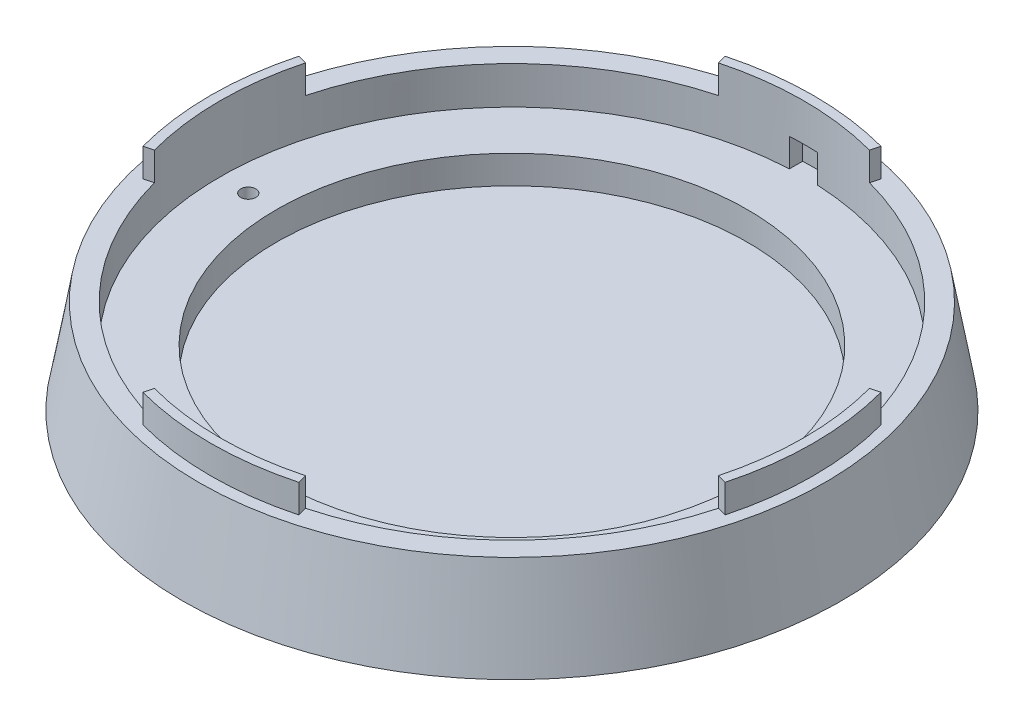
ISO-10303-21;
HEADER;
FILE_DESCRIPTION(('STEP AP214'),'2;1');
FILE_NAME('part.step','',(''),(''),'','','');
FILE_SCHEMA(('AUTOMOTIVE_DESIGN { 1 0 10303 214 1 1 1 1 }'));
ENDSEC;
DATA;
#1=APPLICATION_CONTEXT('core data for automotive mechanical design processes');
#2=APPLICATION_PROTOCOL_DEFINITION('international standard','automotive_design',2000,#1);
#3=PRODUCT_CONTEXT('',#1,'mechanical');
#4=PRODUCT('Part','Part','',(#3));
#5=PRODUCT_RELATED_PRODUCT_CATEGORY('part','',(#4));
#6=PRODUCT_DEFINITION_FORMATION('','',#4);
#7=PRODUCT_DEFINITION_CONTEXT('part definition',#1,'design');
#8=PRODUCT_DEFINITION('design','',#6,#7);
#9=PRODUCT_DEFINITION_SHAPE('','',#8);
#10=(LENGTH_UNIT() NAMED_UNIT(*) SI_UNIT(.MILLI.,.METRE.));
#11=(NAMED_UNIT(*) PLANE_ANGLE_UNIT() SI_UNIT($,.RADIAN.));
#12=(NAMED_UNIT(*) SI_UNIT($,.STERADIAN.) SOLID_ANGLE_UNIT());
#13=UNCERTAINTY_MEASURE_WITH_UNIT(LENGTH_MEASURE(1.E-05),#10,'distance_accuracy_value','');
#14=(GEOMETRIC_REPRESENTATION_CONTEXT(3) GLOBAL_UNCERTAINTY_ASSIGNED_CONTEXT((#13)) GLOBAL_UNIT_ASSIGNED_CONTEXT((#10,
#11,#12)) REPRESENTATION_CONTEXT('',''));
#15=CARTESIAN_POINT('',(0.,0.,0.));
#16=DIRECTION('',(0.,0.,1.));
#17=DIRECTION('',(1.,0.,0.));
#18=AXIS2_PLACEMENT_3D('',#15,#16,#17);
#19=CARTESIAN_POINT('',(0.,10.,0.));
#20=DIRECTION('',(0.,-1.,0.));
#21=DIRECTION('',(0.,0.,-1.));
#22=AXIS2_PLACEMENT_3D('',#19,#20,#21);
#23=CYLINDRICAL_SURFACE('',#22,31.);
#24=CARTESIAN_POINT('',(0.,10.,0.));
#25=DIRECTION('',(0.,1.,0.));
#26=DIRECTION('',(0.,0.,1.));
#27=AXIS2_PLACEMENT_3D('',#24,#25,#26);
#28=CIRCLE('',#27,31.);
#29=CARTESIAN_POINT('',(8.02339039817786,10.,29.9437006149612));
#30=VERTEX_POINT('',#29);
#31=CARTESIAN_POINT('',(29.9437006149611,10.,8.02339039817817));
#32=VERTEX_POINT('',#31);
#33=EDGE_CURVE('E328',#30,#32,#28,.T.);
#34=ORIENTED_EDGE('',*,*,#33,.T.);
#35=DIRECTION('',(0.,-1.,0.));
#36=VECTOR('',#35,1.);
#37=CARTESIAN_POINT('',(29.9437006149611,13.,8.02339039817817));
#38=LINE('',#37,#36);
#39=CARTESIAN_POINT('',(29.9437006149611,13.,8.02339039817817));
#40=VERTEX_POINT('',#39);
#41=EDGE_CURVE('E276',#40,#32,#38,.T.);
#42=ORIENTED_EDGE('',*,*,#41,.F.);
#43=CARTESIAN_POINT('',(0.,13.,0.));
#44=DIRECTION('',(0.,-1.,0.));
#45=DIRECTION('',(0.,0.,-1.));
#46=AXIS2_PLACEMENT_3D('',#43,#44,#45);
#47=CIRCLE('',#46,31.);
#48=CARTESIAN_POINT('',(29.9437006149612,13.,-8.02339039817797));
#49=VERTEX_POINT('',#48);
#50=EDGE_CURVE('E297',#49,#40,#47,.T.);
#51=ORIENTED_EDGE('',*,*,#50,.F.);
#52=DIRECTION('',(0.,-1.,0.));
#53=VECTOR('',#52,1.);
#54=CARTESIAN_POINT('',(29.9437006149612,13.,-8.02339039817797));
#55=LINE('',#54,#53);
#56=CARTESIAN_POINT('',(29.9437006149612,10.,-8.02339039817797));
#57=VERTEX_POINT('',#56);
#58=EDGE_CURVE('E280',#49,#57,#55,.T.);
#59=ORIENTED_EDGE('',*,*,#58,.T.);
#60=CARTESIAN_POINT('',(8.02339039817807,10.,-29.9437006149611));
#61=VERTEX_POINT('',#60);
#62=EDGE_CURVE('E334',#57,#61,#28,.T.);
#63=ORIENTED_EDGE('',*,*,#62,.T.);
#64=DIRECTION('',(0.,-1.,0.));
#65=VECTOR('',#64,1.);
#66=CARTESIAN_POINT('',(8.02339039817807,13.,-29.9437006149611));
#67=LINE('',#66,#65);
#68=CARTESIAN_POINT('',(8.02339039817807,13.,-29.9437006149611));
#69=VERTEX_POINT('',#68);
#70=EDGE_CURVE('E197',#69,#61,#67,.T.);
#71=ORIENTED_EDGE('',*,*,#70,.F.);
#72=CARTESIAN_POINT('',(0.,13.,0.));
#73=DIRECTION('',(0.,-1.,0.));
#74=DIRECTION('',(0.,0.,-1.));
#75=AXIS2_PLACEMENT_3D('',#72,#73,#74);
#76=CIRCLE('',#75,31.);
#77=CARTESIAN_POINT('',(-8.02339039817806,13.,-29.9437006149611));
#78=VERTEX_POINT('',#77);
#79=EDGE_CURVE('E186',#78,#69,#76,.T.);
#80=ORIENTED_EDGE('',*,*,#79,.F.);
#81=DIRECTION('',(0.,-1.,0.));
#82=VECTOR('',#81,1.);
#83=CARTESIAN_POINT('',(-8.02339039817806,13.,-29.9437006149611));
#84=LINE('',#83,#82);
#85=CARTESIAN_POINT('',(-8.02339039817806,10.,-29.9437006149611));
#86=VERTEX_POINT('',#85);
#87=EDGE_CURVE('E193',#78,#86,#84,.T.);
#88=ORIENTED_EDGE('',*,*,#87,.T.);
#89=CARTESIAN_POINT('',(-29.9437006149611,10.,-8.02339039817838));
#90=VERTEX_POINT('',#89);
#91=EDGE_CURVE('E636',#86,#90,#28,.T.);
#92=ORIENTED_EDGE('',*,*,#91,.T.);
#93=DIRECTION('',(0.,-1.,0.));
#94=VECTOR('',#93,1.);
#95=CARTESIAN_POINT('',(-29.9437006149611,13.,-8.02339039817837));
#96=LINE('',#95,#94);
#97=CARTESIAN_POINT('',(-29.9437006149611,13.,-8.02339039817837));
#98=VERTEX_POINT('',#97);
#99=EDGE_CURVE('E66',#98,#90,#96,.T.);
#100=ORIENTED_EDGE('',*,*,#99,.F.);
#101=CARTESIAN_POINT('',(0.,13.,0.));
#102=DIRECTION('',(0.,-1.,0.));
#103=DIRECTION('',(0.,0.,-1.));
#104=AXIS2_PLACEMENT_3D('',#101,#102,#103);
#105=CIRCLE('',#104,31.);
#106=CARTESIAN_POINT('',(-29.9437006149612,13.,8.02339039817777));
#107=VERTEX_POINT('',#106);
#108=EDGE_CURVE('E247',#107,#98,#105,.T.);
#109=ORIENTED_EDGE('',*,*,#108,.F.);
#110=DIRECTION('',(0.,-1.,0.));
#111=VECTOR('',#110,1.);
#112=CARTESIAN_POINT('',(-29.9437006149612,13.,8.02339039817777));
#113=LINE('',#112,#111);
#114=CARTESIAN_POINT('',(-29.9437006149612,10.,8.02339039817777));
#115=VERTEX_POINT('',#114);
#116=EDGE_CURVE('E228',#107,#115,#113,.T.);
#117=ORIENTED_EDGE('',*,*,#116,.T.);
#118=CARTESIAN_POINT('',(-8.02339039817827,10.,29.9437006149611));
#119=VERTEX_POINT('',#118);
#120=EDGE_CURVE('E335',#115,#119,#28,.T.);
#121=ORIENTED_EDGE('',*,*,#120,.T.);
#122=DIRECTION('',(0.,-1.,0.));
#123=VECTOR('',#122,1.);
#124=CARTESIAN_POINT('',(-8.02339039817826,13.,29.9437006149611));
#125=LINE('',#124,#123);
#126=CARTESIAN_POINT('',(-8.02339039817826,13.,29.9437006149611));
#127=VERTEX_POINT('',#126);
#128=EDGE_CURVE('E59',#127,#119,#125,.T.);
#129=ORIENTED_EDGE('',*,*,#128,.F.);
#130=CARTESIAN_POINT('',(0.,13.,0.));
#131=DIRECTION('',(0.,-1.,0.));
#132=DIRECTION('',(0.,0.,-1.));
#133=AXIS2_PLACEMENT_3D('',#130,#131,#132);
#134=CIRCLE('',#133,31.);
#135=CARTESIAN_POINT('',(8.02339039817786,13.,29.9437006149612));
#136=VERTEX_POINT('',#135);
#137=EDGE_CURVE('E271',#136,#127,#134,.T.);
#138=ORIENTED_EDGE('',*,*,#137,.F.);
#139=DIRECTION('',(0.,-1.,0.));
#140=VECTOR('',#139,1.);
#141=CARTESIAN_POINT('',(8.02339039817786,13.,29.9437006149612));
#142=LINE('',#141,#140);
#143=EDGE_CURVE('E255',#136,#30,#142,.T.);
#144=ORIENTED_EDGE('',*,*,#143,.T.);
#145=EDGE_LOOP('',(#34,#42,#51,#59,#63,#71,#80,#88,#92,#100,#109,#117,#121,#129,#138,#144));
#146=FACE_BOUND('',#145,.T.);
#147=CARTESIAN_POINT('',(0.,6.,0.));
#148=DIRECTION('',(0.,1.,0.));
#149=DIRECTION('',(0.,0.,1.));
#150=AXIS2_PLACEMENT_3D('',#147,#148,#149);
#151=CIRCLE('',#150,31.);
#152=CARTESIAN_POINT('',(-1.5,6.,-30.9636884107821));
#153=VERTEX_POINT('',#152);
#154=CARTESIAN_POINT('',(1.5,6.,-30.9636884107821));
#155=VERTEX_POINT('',#154);
#156=EDGE_CURVE('E327',#153,#155,#151,.T.);
#157=ORIENTED_EDGE('',*,*,#156,.F.);
#158=DIRECTION('',(0.,-1.,0.));
#159=VECTOR('',#158,1.);
#160=CARTESIAN_POINT('',(-1.5,10.,-30.9636884107821));
#161=LINE('',#160,#159);
#162=CARTESIAN_POINT('',(-1.5,9.,-30.9636884107821));
#163=VERTEX_POINT('',#162);
#164=EDGE_CURVE('E323',#153,#163,#161,.F.);
#165=ORIENTED_EDGE('',*,*,#164,.T.);
#166=CARTESIAN_POINT('',(0.,9.,0.));
#167=DIRECTION('',(0.,-1.,0.));
#168=DIRECTION('',(0.,0.,-1.));
#169=AXIS2_PLACEMENT_3D('',#166,#167,#168);
#170=CIRCLE('',#169,31.);
#171=CARTESIAN_POINT('',(1.5,9.,-30.9636884107821));
#172=VERTEX_POINT('',#171);
#173=EDGE_CURVE('E11',#163,#172,#170,.T.);
#174=ORIENTED_EDGE('',*,*,#173,.T.);
#175=DIRECTION('',(0.,-1.,0.));
#176=VECTOR('',#175,1.);
#177=CARTESIAN_POINT('',(1.5,10.,-30.9636884107821));
#178=LINE('',#177,#176);
#179=EDGE_CURVE('E325',#172,#155,#178,.T.);
#180=ORIENTED_EDGE('',*,*,#179,.T.);
#181=EDGE_LOOP('',(#157,#165,#174,#180));
#182=FACE_BOUND('',#181,.T.);
#183=ADVANCED_FACE('F43',(#146,#182),#23,.F.);
#184=CARTESIAN_POINT('',(0.,0.,0.));
#185=DIRECTION('',(0.,-1.,0.));
#186=DIRECTION('',(0.,0.,1.));
#187=AXIS2_PLACEMENT_3D('',#184,#185,#186);
#188=CONICAL_SURFACE('',#187,35.,0.174532925199433);
#189=CARTESIAN_POINT('',(0.,0.,0.));
#190=DIRECTION('',(0.,1.,0.));
#191=DIRECTION('',(0.,0.,1.));
#192=AXIS2_PLACEMENT_3D('',#189,#190,#191);
#193=CIRCLE('',#192,35.);
#194=CARTESIAN_POINT('',(0.,0.,35.));
#195=VERTEX_POINT('',#194);
#196=EDGE_CURVE('E51',#195,#195,#193,.T.);
#197=ORIENTED_EDGE('',*,*,#196,.T.);
#198=EDGE_LOOP('',(#197));
#199=FACE_BOUND('',#198,.T.);
#200=CARTESIAN_POINT('',(0.,10.,0.));
#201=DIRECTION('',(0.,1.,0.));
#202=DIRECTION('',(0.,0.,1.));
#203=AXIS2_PLACEMENT_3D('',#200,#201,#202);
#204=CIRCLE('',#203,33.2367301929154);
#205=CARTESIAN_POINT('',(0.,10.,33.2367301929154));
#206=VERTEX_POINT('',#205);
#207=EDGE_CURVE('E337',#206,#206,#204,.T.);
#208=ORIENTED_EDGE('',*,*,#207,.F.);
#209=EDGE_LOOP('',(#208));
#210=FACE_BOUND('',#209,.T.);
#211=ADVANCED_FACE('F44',(#199,#210),#188,.T.);
#212=CARTESIAN_POINT('',(0.,0.,0.));
#213=DIRECTION('',(0.,1.,0.));
#214=DIRECTION('',(0.,0.,1.));
#215=AXIS2_PLACEMENT_3D('',#212,#213,#214);
#216=PLANE('',#215);
#217=ORIENTED_EDGE('',*,*,#196,.F.);
#218=EDGE_LOOP('',(#217));
#219=FACE_BOUND('',#218,.T.);
#220=ADVANCED_FACE('F359',(#219),#216,.F.);
#221=CARTESIAN_POINT('',(0.,10.,0.));
#222=DIRECTION('',(0.,1.,0.));
#223=DIRECTION('',(0.,0.,1.));
#224=AXIS2_PLACEMENT_3D('',#221,#222,#223);
#225=PLANE('',#224);
#226=DIRECTION('',(0.258819045102505,0.,0.965925826289072));
#227=VECTOR('',#226,1.);
#228=CARTESIAN_POINT('',(-8.28220944328057,10.,-30.9096264412502));
#229=LINE('',#228,#227);
#230=CARTESIAN_POINT('',(-8.28220944328058,10.,-30.9096264412502));
#231=VERTEX_POINT('',#230);
#232=EDGE_CURVE('E213',#231,#86,#229,.T.);
#233=ORIENTED_EDGE('',*,*,#232,.F.);
#234=CARTESIAN_POINT('',(0.,10.,0.));
#235=DIRECTION('',(0.,-1.,0.));
#236=DIRECTION('',(0.,0.,-1.));
#237=AXIS2_PLACEMENT_3D('',#234,#235,#236);
#238=CIRCLE('',#237,32.);
#239=CARTESIAN_POINT('',(8.28220944328058,10.,-30.9096264412502));
#240=VERTEX_POINT('',#239);
#241=EDGE_CURVE('E212',#231,#240,#238,.T.);
#242=ORIENTED_EDGE('',*,*,#241,.T.);
#243=DIRECTION('',(-0.258819045102506,0.,0.965925826289072));
#244=VECTOR('',#243,1.);
#245=CARTESIAN_POINT('',(8.28220944328058,10.,-30.9096264412502));
#246=LINE('',#245,#244);
#247=EDGE_CURVE('E633',#240,#61,#246,.T.);
#248=ORIENTED_EDGE('',*,*,#247,.T.);
#249=ORIENTED_EDGE('',*,*,#62,.F.);
#250=DIRECTION('',(-0.965925826289073,0.,0.258819045102502));
#251=VECTOR('',#250,1.);
#252=CARTESIAN_POINT('',(30.9096264412502,10.,-8.28220944328046));
#253=LINE('',#252,#251);
#254=CARTESIAN_POINT('',(30.9096264412502,10.,-8.28220944328046));
#255=VERTEX_POINT('',#254);
#256=EDGE_CURVE('E251',#255,#57,#253,.T.);
#257=ORIENTED_EDGE('',*,*,#256,.F.);
#258=CARTESIAN_POINT('',(0.,10.,0.));
#259=DIRECTION('',(0.,-1.,0.));
#260=DIRECTION('',(0.,0.,-1.));
#261=AXIS2_PLACEMENT_3D('',#258,#259,#260);
#262=CIRCLE('',#261,32.);
#263=CARTESIAN_POINT('',(30.9096264412502,10.,8.28220944328068));
#264=VERTEX_POINT('',#263);
#265=EDGE_CURVE('E287',#255,#264,#262,.T.);
#266=ORIENTED_EDGE('',*,*,#265,.T.);
#267=DIRECTION('',(-0.965925826289072,0.,-0.258819045102509));
#268=VECTOR('',#267,1.);
#269=CARTESIAN_POINT('',(30.9096264412502,10.,8.28220944328068));
#270=LINE('',#269,#268);
#271=EDGE_CURVE('E286',#264,#32,#270,.T.);
#272=ORIENTED_EDGE('',*,*,#271,.T.);
#273=ORIENTED_EDGE('',*,*,#33,.F.);
#274=DIRECTION('',(-0.258819045102499,0.,-0.965925826289074));
#275=VECTOR('',#274,1.);
#276=CARTESIAN_POINT('',(8.28220944328036,10.,30.9096264412503));
#277=LINE('',#276,#275);
#278=CARTESIAN_POINT('',(8.28220944328036,10.,30.9096264412503));
#279=VERTEX_POINT('',#278);
#280=EDGE_CURVE('E226',#279,#30,#277,.T.);
#281=ORIENTED_EDGE('',*,*,#280,.F.);
#282=CARTESIAN_POINT('',(0.,10.,0.));
#283=DIRECTION('',(0.,-1.,0.));
#284=DIRECTION('',(0.,0.,-1.));
#285=AXIS2_PLACEMENT_3D('',#282,#283,#284);
#286=CIRCLE('',#285,32.);
#287=CARTESIAN_POINT('',(-8.28220944328079,10.,30.9096264412502));
#288=VERTEX_POINT('',#287);
#289=EDGE_CURVE('E261',#279,#288,#286,.T.);
#290=ORIENTED_EDGE('',*,*,#289,.T.);
#291=DIRECTION('',(0.258819045102511,0.,-0.965925826289071));
#292=VECTOR('',#291,1.);
#293=CARTESIAN_POINT('',(-8.28220944328079,10.,30.9096264412502));
#294=LINE('',#293,#292);
#295=EDGE_CURVE('E263',#288,#119,#294,.T.);
#296=ORIENTED_EDGE('',*,*,#295,.T.);
#297=ORIENTED_EDGE('',*,*,#120,.F.);
#298=DIRECTION('',(0.965925826289076,0.,-0.258819045102494));
#299=VECTOR('',#298,1.);
#300=CARTESIAN_POINT('',(-30.9096264412503,10.,8.28220944328025));
#301=LINE('',#300,#299);
#302=CARTESIAN_POINT('',(-30.9096264412503,10.,8.28220944328025));
#303=VERTEX_POINT('',#302);
#304=EDGE_CURVE('E241',#303,#115,#301,.T.);
#305=ORIENTED_EDGE('',*,*,#304,.F.);
#306=CARTESIAN_POINT('',(0.,10.,0.));
#307=DIRECTION('',(0.,-1.,0.));
#308=DIRECTION('',(0.,0.,-1.));
#309=AXIS2_PLACEMENT_3D('',#306,#307,#308);
#310=CIRCLE('',#309,32.);
#311=CARTESIAN_POINT('',(-30.9096264412501,10.,-8.2822094432809));
#312=VERTEX_POINT('',#311);
#313=EDGE_CURVE('E232',#303,#312,#310,.T.);
#314=ORIENTED_EDGE('',*,*,#313,.T.);
#315=DIRECTION('',(0.96592582628907,0.,0.258819045102516));
#316=VECTOR('',#315,1.);
#317=CARTESIAN_POINT('',(-30.9096264412501,10.,-8.2822094432809));
#318=LINE('',#317,#316);
#319=EDGE_CURVE('E238',#312,#90,#318,.T.);
#320=ORIENTED_EDGE('',*,*,#319,.T.);
#321=ORIENTED_EDGE('',*,*,#91,.F.);
#322=EDGE_LOOP('',(#233,#242,#248,#249,#257,#266,#272,#273,#281,#290,#296,#297,#305,#314,#320,#321));
#323=FACE_BOUND('',#322,.T.);
#324=ORIENTED_EDGE('',*,*,#207,.T.);
#325=EDGE_LOOP('',(#324));
#326=FACE_BOUND('',#325,.T.);
#327=ADVANCED_FACE('F365',(#323,#326),#225,.T.);
#328=CARTESIAN_POINT('',(0.,6.,0.));
#329=DIRECTION('',(0.,1.,0.));
#330=DIRECTION('',(0.,0.,1.));
#331=AXIS2_PLACEMENT_3D('',#328,#329,#330);
#332=PLANE('',#331);
#333=ORIENTED_EDGE('',*,*,#156,.T.);
#334=DIRECTION('',(0.,0.,-1.));
#335=VECTOR('',#334,1.);
#336=CARTESIAN_POINT('',(1.5,6.,-30.5426221518449));
#337=LINE('',#336,#335);
#338=CARTESIAN_POINT('',(1.5,6.,-32.3652591523689));
#339=VERTEX_POINT('',#338);
#340=EDGE_CURVE('E308',#155,#339,#337,.T.);
#341=ORIENTED_EDGE('',*,*,#340,.T.);
#342=CARTESIAN_POINT('',(0.,6.,0.));
#343=DIRECTION('',(0.,1.,0.));
#344=DIRECTION('',(0.,0.,-1.));
#345=AXIS2_PLACEMENT_3D('',#342,#343,#344);
#346=CIRCLE('',#345,32.4);
#347=CARTESIAN_POINT('',(-1.5,6.,-32.3652591523689));
#348=VERTEX_POINT('',#347);
#349=EDGE_CURVE('E220',#339,#348,#346,.T.);
#350=ORIENTED_EDGE('',*,*,#349,.T.);
#351=DIRECTION('',(0.,0.,1.));
#352=VECTOR('',#351,1.);
#353=CARTESIAN_POINT('',(-1.5,6.,-32.3652591523689));
#354=LINE('',#353,#352);
#355=EDGE_CURVE('E219',#348,#153,#354,.T.);
#356=ORIENTED_EDGE('',*,*,#355,.T.);
#357=EDGE_LOOP('',(#333,#341,#350,#356));
#358=FACE_BOUND('',#357,.T.);
#359=CARTESIAN_POINT('',(-28.,6.,0.));
#360=DIRECTION('',(0.,1.,0.));
#361=DIRECTION('',(0.,0.,1.));
#362=AXIS2_PLACEMENT_3D('',#359,#360,#361);
#363=CIRCLE('',#362,0.799999999999999);
#364=CARTESIAN_POINT('',(-28.,6.,0.799999999999999));
#365=VERTEX_POINT('',#364);
#366=EDGE_CURVE('E338',#365,#365,#363,.T.);
#367=ORIENTED_EDGE('',*,*,#366,.F.);
#368=EDGE_LOOP('',(#367));
#369=FACE_BOUND('',#368,.T.);
#370=CARTESIAN_POINT('',(28.,6.,0.));
#371=DIRECTION('',(0.,1.,0.));
#372=DIRECTION('',(0.,0.,1.));
#373=AXIS2_PLACEMENT_3D('',#370,#371,#372);
#374=CIRCLE('',#373,0.799999999999999);
#375=CARTESIAN_POINT('',(28.,6.,0.799999999999999));
#376=VERTEX_POINT('',#375);
#377=EDGE_CURVE('E344',#376,#376,#374,.T.);
#378=ORIENTED_EDGE('',*,*,#377,.F.);
#379=EDGE_LOOP('',(#378));
#380=FACE_BOUND('',#379,.T.);
#381=CARTESIAN_POINT('',(0.,6.,0.));
#382=DIRECTION('',(0.,1.,0.));
#383=DIRECTION('',(0.,0.,1.));
#384=AXIS2_PLACEMENT_3D('',#381,#382,#383);
#385=CIRCLE('',#384,25.);
#386=CARTESIAN_POINT('',(0.,6.,25.));
#387=VERTEX_POINT('',#386);
#388=EDGE_CURVE('E332',#387,#387,#385,.T.);
#389=ORIENTED_EDGE('',*,*,#388,.F.);
#390=EDGE_LOOP('',(#389));
#391=FACE_BOUND('',#390,.T.);
#392=ADVANCED_FACE('F370',(#358,#369,#380,#391),#332,.T.);
#393=CARTESIAN_POINT('',(0.,3.,0.));
#394=DIRECTION('',(0.,1.,0.));
#395=DIRECTION('',(0.,0.,1.));
#396=AXIS2_PLACEMENT_3D('',#393,#394,#395);
#397=PLANE('',#396);
#398=CARTESIAN_POINT('',(0.,3.,0.));
#399=DIRECTION('',(0.,1.,0.));
#400=DIRECTION('',(0.,0.,1.));
#401=AXIS2_PLACEMENT_3D('',#398,#399,#400);
#402=CIRCLE('',#401,25.);
#403=CARTESIAN_POINT('',(0.,3.,25.));
#404=VERTEX_POINT('',#403);
#405=EDGE_CURVE('E352',#404,#404,#402,.T.);
#406=ORIENTED_EDGE('',*,*,#405,.T.);
#407=EDGE_LOOP('',(#406));
#408=FACE_BOUND('',#407,.T.);
#409=ADVANCED_FACE('F400',(#408),#397,.T.);
#410=CARTESIAN_POINT('',(0.,3.,0.));
#411=DIRECTION('',(0.,1.,0.));
#412=DIRECTION('',(0.,0.,1.));
#413=AXIS2_PLACEMENT_3D('',#410,#411,#412);
#414=CYLINDRICAL_SURFACE('',#413,25.);
#415=ORIENTED_EDGE('',*,*,#405,.F.);
#416=EDGE_LOOP('',(#415));
#417=FACE_BOUND('',#416,.T.);
#418=ORIENTED_EDGE('',*,*,#388,.T.);
#419=EDGE_LOOP('',(#418));
#420=FACE_BOUND('',#419,.T.);
#421=ADVANCED_FACE('F397',(#417,#420),#414,.F.);
#422=CARTESIAN_POINT('',(28.,2.48068849522205,0.));
#423=DIRECTION('',(0.,1.,0.));
#424=DIRECTION('',(0.,0.,1.));
#425=AXIS2_PLACEMENT_3D('',#422,#423,#424);
#426=CONICAL_SURFACE('',#425,0.799999999999999,1.02974425867665);
#427=CARTESIAN_POINT('',(28.,2.,0.));
#428=VERTEX_POINT('',#427);
#429=VERTEX_LOOP('',#428);
#430=FACE_BOUND('',#429,.T.);
#431=CARTESIAN_POINT('',(28.,2.48068849522205,0.));
#432=DIRECTION('',(0.,1.,0.));
#433=DIRECTION('',(0.,0.,1.));
#434=AXIS2_PLACEMENT_3D('',#431,#432,#433);
#435=CIRCLE('',#434,0.799999999999999);
#436=CARTESIAN_POINT('',(28.,2.48068849522205,0.799999999999999));
#437=VERTEX_POINT('',#436);
#438=EDGE_CURVE('E346',#437,#437,#435,.T.);
#439=ORIENTED_EDGE('',*,*,#438,.T.);
#440=EDGE_LOOP('',(#439));
#441=FACE_BOUND('',#440,.T.);
#442=ADVANCED_FACE('F395',(#430,#441),#426,.F.);
#443=CARTESIAN_POINT('',(28.,6.,0.));
#444=DIRECTION('',(0.,1.,0.));
#445=DIRECTION('',(0.,0.,1.));
#446=AXIS2_PLACEMENT_3D('',#443,#444,#445);
#447=CYLINDRICAL_SURFACE('',#446,0.799999999999999);
#448=ORIENTED_EDGE('',*,*,#438,.F.);
#449=EDGE_LOOP('',(#448));
#450=FACE_BOUND('',#449,.T.);
#451=ORIENTED_EDGE('',*,*,#377,.T.);
#452=EDGE_LOOP('',(#451));
#453=FACE_BOUND('',#452,.T.);
#454=ADVANCED_FACE('F389',(#450,#453),#447,.F.);
#455=CARTESIAN_POINT('',(-28.,2.48068849522205,0.));
#456=DIRECTION('',(0.,1.,0.));
#457=DIRECTION('',(0.,0.,1.));
#458=AXIS2_PLACEMENT_3D('',#455,#456,#457);
#459=CONICAL_SURFACE('',#458,0.799999999999999,1.02974425867665);
#460=CARTESIAN_POINT('',(-28.,2.,0.));
#461=VERTEX_POINT('',#460);
#462=VERTEX_LOOP('',#461);
#463=FACE_BOUND('',#462,.T.);
#464=CARTESIAN_POINT('',(-28.,2.48068849522205,0.));
#465=DIRECTION('',(0.,1.,0.));
#466=DIRECTION('',(0.,0.,1.));
#467=AXIS2_PLACEMENT_3D('',#464,#465,#466);
#468=CIRCLE('',#467,0.799999999999999);
#469=CARTESIAN_POINT('',(-28.,2.48068849522205,0.799999999999999));
#470=VERTEX_POINT('',#469);
#471=EDGE_CURVE('E339',#470,#470,#468,.T.);
#472=ORIENTED_EDGE('',*,*,#471,.T.);
#473=EDGE_LOOP('',(#472));
#474=FACE_BOUND('',#473,.T.);
#475=ADVANCED_FACE('F381',(#463,#474),#459,.F.);
#476=CARTESIAN_POINT('',(-28.,6.,0.));
#477=DIRECTION('',(0.,1.,0.));
#478=DIRECTION('',(0.,0.,1.));
#479=AXIS2_PLACEMENT_3D('',#476,#477,#478);
#480=CYLINDRICAL_SURFACE('',#479,0.799999999999999);
#481=ORIENTED_EDGE('',*,*,#471,.F.);
#482=EDGE_LOOP('',(#481));
#483=FACE_BOUND('',#482,.T.);
#484=ORIENTED_EDGE('',*,*,#366,.T.);
#485=EDGE_LOOP('',(#484));
#486=FACE_BOUND('',#485,.T.);
#487=ADVANCED_FACE('F379',(#483,#486),#480,.F.);
#488=CARTESIAN_POINT('',(0.,9.,0.));
#489=DIRECTION('',(0.,-1.,0.));
#490=DIRECTION('',(0.,0.,-1.));
#491=AXIS2_PLACEMENT_3D('',#488,#489,#490);
#492=CYLINDRICAL_SURFACE('',#491,32.4);
#493=ORIENTED_EDGE('',*,*,#349,.F.);
#494=DIRECTION('',(0.,-1.,0.));
#495=VECTOR('',#494,1.);
#496=CARTESIAN_POINT('',(1.5,9.,-32.3652591523689));
#497=LINE('',#496,#495);
#498=CARTESIAN_POINT('',(1.5,9.,-32.3652591523689));
#499=VERTEX_POINT('',#498);
#500=EDGE_CURVE('E315',#499,#339,#497,.T.);
#501=ORIENTED_EDGE('',*,*,#500,.F.);
#502=CARTESIAN_POINT('',(0.,9.,0.));
#503=DIRECTION('',(0.,1.,0.));
#504=DIRECTION('',(0.,0.,-1.));
#505=AXIS2_PLACEMENT_3D('',#502,#503,#504);
#506=CIRCLE('',#505,32.4);
#507=CARTESIAN_POINT('',(-1.5,9.,-32.3652591523689));
#508=VERTEX_POINT('',#507);
#509=EDGE_CURVE('E302',#499,#508,#506,.T.);
#510=ORIENTED_EDGE('',*,*,#509,.T.);
#511=DIRECTION('',(0.,-1.,0.));
#512=VECTOR('',#511,1.);
#513=CARTESIAN_POINT('',(-1.5,9.,-32.3652591523689));
#514=LINE('',#513,#512);
#515=EDGE_CURVE('E316',#508,#348,#514,.T.);
#516=ORIENTED_EDGE('',*,*,#515,.T.);
#517=EDGE_LOOP('',(#493,#501,#510,#516));
#518=FACE_BOUND('',#517,.T.);
#519=ADVANCED_FACE('F384',(#518),#492,.F.);
#520=CARTESIAN_POINT('',(-1.5,9.,-32.3652591523689));
#521=DIRECTION('',(1.,0.,0.));
#522=DIRECTION('',(0.,0.,-1.));
#523=AXIS2_PLACEMENT_3D('',#520,#521,#522);
#524=PLANE('',#523);
#525=ORIENTED_EDGE('',*,*,#355,.F.);
#526=ORIENTED_EDGE('',*,*,#515,.F.);
#527=DIRECTION('',(0.,0.,1.));
#528=VECTOR('',#527,1.);
#529=CARTESIAN_POINT('',(-1.5,9.,-32.3652591523689));
#530=LINE('',#529,#528);
#531=EDGE_CURVE('E310',#508,#163,#530,.T.);
#532=ORIENTED_EDGE('',*,*,#531,.T.);
#533=ORIENTED_EDGE('',*,*,#164,.F.);
#534=EDGE_LOOP('',(#525,#526,#532,#533));
#535=FACE_BOUND('',#534,.T.);
#536=ADVANCED_FACE('F429',(#535),#524,.T.);
#537=CARTESIAN_POINT('',(1.5,9.,-30.5426221518449));
#538=DIRECTION('',(-1.,0.,0.));
#539=DIRECTION('',(0.,0.,1.));
#540=AXIS2_PLACEMENT_3D('',#537,#538,#539);
#541=PLANE('',#540);
#542=DIRECTION('',(0.,0.,-1.));
#543=VECTOR('',#542,1.);
#544=CARTESIAN_POINT('',(1.5,9.,-30.5426221518449));
#545=LINE('',#544,#543);
#546=EDGE_CURVE('E311',#172,#499,#545,.T.);
#547=ORIENTED_EDGE('',*,*,#546,.T.);
#548=ORIENTED_EDGE('',*,*,#500,.T.);
#549=ORIENTED_EDGE('',*,*,#340,.F.);
#550=ORIENTED_EDGE('',*,*,#179,.F.);
#551=EDGE_LOOP('',(#547,#548,#549,#550));
#552=FACE_BOUND('',#551,.T.);
#553=ADVANCED_FACE('F422',(#552),#541,.T.);
#554=CARTESIAN_POINT('',(0.,9.,0.));
#555=DIRECTION('',(0.,-1.,0.));
#556=DIRECTION('',(0.,0.,-1.));
#557=AXIS2_PLACEMENT_3D('',#554,#555,#556);
#558=PLANE('',#557);
#559=ORIENTED_EDGE('',*,*,#531,.F.);
#560=ORIENTED_EDGE('',*,*,#509,.F.);
#561=ORIENTED_EDGE('',*,*,#546,.F.);
#562=ORIENTED_EDGE('',*,*,#173,.F.);
#563=EDGE_LOOP('',(#559,#560,#561,#562));
#564=FACE_BOUND('',#563,.T.);
#565=ADVANCED_FACE('F431',(#564),#558,.T.);
#566=CARTESIAN_POINT('',(30.9096264412502,13.,-8.28220944328046));
#567=DIRECTION('',(0.258819045102502,0.,0.965925826289073));
#568=DIRECTION('',(0.965925826289074,0.,-0.258819045102502));
#569=AXIS2_PLACEMENT_3D('',#566,#567,#568);
#570=PLANE('',#569);
#571=ORIENTED_EDGE('',*,*,#256,.T.);
#572=ORIENTED_EDGE('',*,*,#58,.F.);
#573=DIRECTION('',(-0.965925826289073,0.,0.258819045102502));
#574=VECTOR('',#573,1.);
#575=CARTESIAN_POINT('',(30.9096264412502,13.,-8.28220944328046));
#576=LINE('',#575,#574);
#577=CARTESIAN_POINT('',(30.9096264412502,13.,-8.28220944328046));
#578=VERTEX_POINT('',#577);
#579=EDGE_CURVE('E288',#578,#49,#576,.T.);
#580=ORIENTED_EDGE('',*,*,#579,.F.);
#581=DIRECTION('',(0.,-1.,0.));
#582=VECTOR('',#581,1.);
#583=CARTESIAN_POINT('',(30.9096264412502,13.,-8.28220944328046));
#584=LINE('',#583,#582);
#585=EDGE_CURVE('E282',#578,#255,#584,.T.);
#586=ORIENTED_EDGE('',*,*,#585,.T.);
#587=EDGE_LOOP('',(#571,#572,#580,#586));
#588=FACE_BOUND('',#587,.T.);
#589=ADVANCED_FACE('F435',(#588),#570,.F.);
#590=CARTESIAN_POINT('',(30.9096264412502,13.,8.28220944328068));
#591=DIRECTION('',(-0.258819045102509,0.,0.965925826289071));
#592=DIRECTION('',(0.965925826289071,0.,0.258819045102509));
#593=AXIS2_PLACEMENT_3D('',#590,#591,#592);
#594=PLANE('',#593);
#595=ORIENTED_EDGE('',*,*,#271,.F.);
#596=DIRECTION('',(0.,-1.,0.));
#597=VECTOR('',#596,1.);
#598=CARTESIAN_POINT('',(30.9096264412502,13.,8.28220944328068));
#599=LINE('',#598,#597);
#600=CARTESIAN_POINT('',(30.9096264412502,13.,8.28220944328068));
#601=VERTEX_POINT('',#600);
#602=EDGE_CURVE('E281',#601,#264,#599,.T.);
#603=ORIENTED_EDGE('',*,*,#602,.F.);
#604=DIRECTION('',(-0.965925826289072,0.,-0.258819045102509));
#605=VECTOR('',#604,1.);
#606=CARTESIAN_POINT('',(30.9096264412502,13.,8.28220944328068));
#607=LINE('',#606,#605);
#608=EDGE_CURVE('E300',#601,#40,#607,.T.);
#609=ORIENTED_EDGE('',*,*,#608,.T.);
#610=ORIENTED_EDGE('',*,*,#41,.T.);
#611=EDGE_LOOP('',(#595,#603,#609,#610));
#612=FACE_BOUND('',#611,.T.);
#613=ADVANCED_FACE('F438',(#612),#594,.T.);
#614=CARTESIAN_POINT('',(0.,13.,0.));
#615=DIRECTION('',(0.,-1.,0.));
#616=DIRECTION('',(0.,0.,-1.));
#617=AXIS2_PLACEMENT_3D('',#614,#615,#616);
#618=CYLINDRICAL_SURFACE('',#617,32.);
#619=ORIENTED_EDGE('',*,*,#265,.F.);
#620=ORIENTED_EDGE('',*,*,#585,.F.);
#621=CARTESIAN_POINT('',(0.,13.,0.));
#622=DIRECTION('',(0.,-1.,0.));
#623=DIRECTION('',(0.,0.,-1.));
#624=AXIS2_PLACEMENT_3D('',#621,#622,#623);
#625=CIRCLE('',#624,32.);
#626=EDGE_CURVE('E284',#578,#601,#625,.T.);
#627=ORIENTED_EDGE('',*,*,#626,.T.);
#628=ORIENTED_EDGE('',*,*,#602,.T.);
#629=EDGE_LOOP('',(#619,#620,#627,#628));
#630=FACE_BOUND('',#629,.T.);
#631=ADVANCED_FACE('F494',(#630),#618,.T.);
#632=CARTESIAN_POINT('',(0.,13.,0.));
#633=DIRECTION('',(0.,-1.,0.));
#634=DIRECTION('',(0.,0.,-1.));
#635=AXIS2_PLACEMENT_3D('',#632,#633,#634);
#636=PLANE('',#635);
#637=ORIENTED_EDGE('',*,*,#579,.T.);
#638=ORIENTED_EDGE('',*,*,#50,.T.);
#639=ORIENTED_EDGE('',*,*,#608,.F.);
#640=ORIENTED_EDGE('',*,*,#626,.F.);
#641=EDGE_LOOP('',(#637,#638,#639,#640));
#642=FACE_BOUND('',#641,.T.);
#643=ADVANCED_FACE('F442',(#642),#636,.F.);
#644=CARTESIAN_POINT('',(8.28220944328036,13.,30.9096264412503));
#645=DIRECTION('',(-0.965925826289074,0.,0.258819045102499));
#646=DIRECTION('',(0.258819045102499,0.,0.965925826289074));
#647=AXIS2_PLACEMENT_3D('',#644,#645,#646);
#648=PLANE('',#647);
#649=ORIENTED_EDGE('',*,*,#280,.T.);
#650=ORIENTED_EDGE('',*,*,#143,.F.);
#651=DIRECTION('',(-0.258819045102499,0.,-0.965925826289074));
#652=VECTOR('',#651,1.);
#653=CARTESIAN_POINT('',(8.28220944328036,13.,30.9096264412503));
#654=LINE('',#653,#652);
#655=CARTESIAN_POINT('',(8.28220944328036,13.,30.9096264412503));
#656=VERTEX_POINT('',#655);
#657=EDGE_CURVE('E264',#656,#136,#654,.T.);
#658=ORIENTED_EDGE('',*,*,#657,.F.);
#659=DIRECTION('',(0.,-1.,0.));
#660=VECTOR('',#659,1.);
#661=CARTESIAN_POINT('',(8.28220944328036,13.,30.9096264412503));
#662=LINE('',#661,#660);
#663=EDGE_CURVE('E259',#656,#279,#662,.T.);
#664=ORIENTED_EDGE('',*,*,#663,.T.);
#665=EDGE_LOOP('',(#649,#650,#658,#664));
#666=FACE_BOUND('',#665,.T.);
#667=ADVANCED_FACE('F515',(#666),#648,.F.);
#668=CARTESIAN_POINT('',(-8.28220944328079,13.,30.9096264412502));
#669=DIRECTION('',(-0.965925826289071,0.,-0.258819045102511));
#670=DIRECTION('',(-0.258819045102512,0.,0.965925826289071));
#671=AXIS2_PLACEMENT_3D('',#668,#669,#670);
#672=PLANE('',#671);
#673=ORIENTED_EDGE('',*,*,#295,.F.);
#674=DIRECTION('',(0.,-1.,0.));
#675=VECTOR('',#674,1.);
#676=CARTESIAN_POINT('',(-8.28220944328079,13.,30.9096264412502));
#677=LINE('',#676,#675);
#678=CARTESIAN_POINT('',(-8.28220944328079,13.,30.9096264412502));
#679=VERTEX_POINT('',#678);
#680=EDGE_CURVE('E257',#679,#288,#677,.T.);
#681=ORIENTED_EDGE('',*,*,#680,.F.);
#682=DIRECTION('',(0.258819045102511,0.,-0.965925826289071));
#683=VECTOR('',#682,1.);
#684=CARTESIAN_POINT('',(-8.28220944328079,13.,30.9096264412502));
#685=LINE('',#684,#683);
#686=EDGE_CURVE('E272',#679,#127,#685,.T.);
#687=ORIENTED_EDGE('',*,*,#686,.T.);
#688=ORIENTED_EDGE('',*,*,#128,.T.);
#689=EDGE_LOOP('',(#673,#681,#687,#688));
#690=FACE_BOUND('',#689,.T.);
#691=ADVANCED_FACE('F521',(#690),#672,.T.);
#692=CARTESIAN_POINT('',(0.,13.,0.));
#693=DIRECTION('',(0.,-1.,0.));
#694=DIRECTION('',(0.,0.,-1.));
#695=AXIS2_PLACEMENT_3D('',#692,#693,#694);
#696=CYLINDRICAL_SURFACE('',#695,32.);
#697=ORIENTED_EDGE('',*,*,#289,.F.);
#698=ORIENTED_EDGE('',*,*,#663,.F.);
#699=CARTESIAN_POINT('',(0.,13.,0.));
#700=DIRECTION('',(0.,-1.,0.));
#701=DIRECTION('',(0.,0.,-1.));
#702=AXIS2_PLACEMENT_3D('',#699,#700,#701);
#703=CIRCLE('',#702,32.);
#704=EDGE_CURVE('E258',#656,#679,#703,.T.);
#705=ORIENTED_EDGE('',*,*,#704,.T.);
#706=ORIENTED_EDGE('',*,*,#680,.T.);
#707=EDGE_LOOP('',(#697,#698,#705,#706));
#708=FACE_BOUND('',#707,.T.);
#709=ADVANCED_FACE('F532',(#708),#696,.T.);
#710=CARTESIAN_POINT('',(0.,13.,0.));
#711=DIRECTION('',(0.,-1.,0.));
#712=DIRECTION('',(0.,0.,-1.));
#713=AXIS2_PLACEMENT_3D('',#710,#711,#712);
#714=PLANE('',#713);
#715=ORIENTED_EDGE('',*,*,#657,.T.);
#716=ORIENTED_EDGE('',*,*,#137,.T.);
#717=ORIENTED_EDGE('',*,*,#686,.F.);
#718=ORIENTED_EDGE('',*,*,#704,.F.);
#719=EDGE_LOOP('',(#715,#716,#717,#718));
#720=FACE_BOUND('',#719,.T.);
#721=ADVANCED_FACE('F538',(#720),#714,.F.);
#722=CARTESIAN_POINT('',(-30.9096264412503,13.,8.28220944328025));
#723=DIRECTION('',(-0.258819045102494,0.,-0.965925826289075));
#724=DIRECTION('',(-0.965925826289076,0.,0.258819045102494));
#725=AXIS2_PLACEMENT_3D('',#722,#723,#724);
#726=PLANE('',#725);
#727=ORIENTED_EDGE('',*,*,#304,.T.);
#728=ORIENTED_EDGE('',*,*,#116,.F.);
#729=DIRECTION('',(0.965925826289076,0.,-0.258819045102494));
#730=VECTOR('',#729,1.);
#731=CARTESIAN_POINT('',(-30.9096264412503,13.,8.28220944328025));
#732=LINE('',#731,#730);
#733=CARTESIAN_POINT('',(-30.9096264412503,13.,8.28220944328025));
#734=VERTEX_POINT('',#733);
#735=EDGE_CURVE('E237',#734,#107,#732,.T.);
#736=ORIENTED_EDGE('',*,*,#735,.F.);
#737=DIRECTION('',(0.,-1.,0.));
#738=VECTOR('',#737,1.);
#739=CARTESIAN_POINT('',(-30.9096264412503,13.,8.28220944328025));
#740=LINE('',#739,#738);
#741=EDGE_CURVE('E235',#734,#303,#740,.T.);
#742=ORIENTED_EDGE('',*,*,#741,.T.);
#743=EDGE_LOOP('',(#727,#728,#736,#742));
#744=FACE_BOUND('',#743,.T.);
#745=ADVANCED_FACE('F548',(#744),#726,.F.);
#746=CARTESIAN_POINT('',(-30.9096264412501,13.,-8.2822094432809));
#747=DIRECTION('',(0.258819045102516,0.,-0.965925826289069));
#748=DIRECTION('',(-0.96592582628907,0.,-0.258819045102516));
#749=AXIS2_PLACEMENT_3D('',#746,#747,#748);
#750=PLANE('',#749);
#751=ORIENTED_EDGE('',*,*,#319,.F.);
#752=DIRECTION('',(0.,-1.,0.));
#753=VECTOR('',#752,1.);
#754=CARTESIAN_POINT('',(-30.9096264412501,13.,-8.2822094432809));
#755=LINE('',#754,#753);
#756=CARTESIAN_POINT('',(-30.9096264412501,13.,-8.2822094432809));
#757=VERTEX_POINT('',#756);
#758=EDGE_CURVE('E229',#757,#312,#755,.T.);
#759=ORIENTED_EDGE('',*,*,#758,.F.);
#760=DIRECTION('',(0.96592582628907,0.,0.258819045102516));
#761=VECTOR('',#760,1.);
#762=CARTESIAN_POINT('',(-30.9096264412501,13.,-8.2822094432809));
#763=LINE('',#762,#761);
#764=EDGE_CURVE('E246',#757,#98,#763,.T.);
#765=ORIENTED_EDGE('',*,*,#764,.T.);
#766=ORIENTED_EDGE('',*,*,#99,.T.);
#767=EDGE_LOOP('',(#751,#759,#765,#766));
#768=FACE_BOUND('',#767,.T.);
#769=ADVANCED_FACE('F557',(#768),#750,.T.);
#770=CARTESIAN_POINT('',(0.,13.,0.));
#771=DIRECTION('',(0.,-1.,0.));
#772=DIRECTION('',(0.,0.,-1.));
#773=AXIS2_PLACEMENT_3D('',#770,#771,#772);
#774=CYLINDRICAL_SURFACE('',#773,32.);
#775=ORIENTED_EDGE('',*,*,#313,.F.);
#776=ORIENTED_EDGE('',*,*,#741,.F.);
#777=CARTESIAN_POINT('',(0.,13.,0.));
#778=DIRECTION('',(0.,-1.,0.));
#779=DIRECTION('',(0.,0.,-1.));
#780=AXIS2_PLACEMENT_3D('',#777,#778,#779);
#781=CIRCLE('',#780,32.);
#782=EDGE_CURVE('E234',#734,#757,#781,.T.);
#783=ORIENTED_EDGE('',*,*,#782,.T.);
#784=ORIENTED_EDGE('',*,*,#758,.T.);
#785=EDGE_LOOP('',(#775,#776,#783,#784));
#786=FACE_BOUND('',#785,.T.);
#787=ADVANCED_FACE('F569',(#786),#774,.T.);
#788=CARTESIAN_POINT('',(0.,13.,0.));
#789=DIRECTION('',(0.,-1.,0.));
#790=DIRECTION('',(0.,0.,-1.));
#791=AXIS2_PLACEMENT_3D('',#788,#789,#790);
#792=PLANE('',#791);
#793=ORIENTED_EDGE('',*,*,#735,.T.);
#794=ORIENTED_EDGE('',*,*,#108,.T.);
#795=ORIENTED_EDGE('',*,*,#764,.F.);
#796=ORIENTED_EDGE('',*,*,#782,.F.);
#797=EDGE_LOOP('',(#793,#794,#795,#796));
#798=FACE_BOUND('',#797,.T.);
#799=ADVANCED_FACE('F576',(#798),#792,.F.);
#800=CARTESIAN_POINT('',(-8.28220944328057,13.,-30.9096264412502));
#801=DIRECTION('',(0.965925826289073,0.,-0.258819045102505));
#802=DIRECTION('',(-0.258819045102505,0.,-0.965925826289073));
#803=AXIS2_PLACEMENT_3D('',#800,#801,#802);
#804=PLANE('',#803);
#805=ORIENTED_EDGE('',*,*,#232,.T.);
#806=ORIENTED_EDGE('',*,*,#87,.F.);
#807=DIRECTION('',(0.258819045102505,0.,0.965925826289072));
#808=VECTOR('',#807,1.);
#809=CARTESIAN_POINT('',(-8.28220944328057,13.,-30.9096264412502));
#810=LINE('',#809,#808);
#811=CARTESIAN_POINT('',(-8.28220944328058,13.,-30.9096264412502));
#812=VERTEX_POINT('',#811);
#813=EDGE_CURVE('E205',#812,#78,#810,.T.);
#814=ORIENTED_EDGE('',*,*,#813,.F.);
#815=DIRECTION('',(0.,-1.,0.));
#816=VECTOR('',#815,1.);
#817=CARTESIAN_POINT('',(-8.28220944328058,13.,-30.9096264412502));
#818=LINE('',#817,#816);
#819=EDGE_CURVE('E629',#812,#231,#818,.T.);
#820=ORIENTED_EDGE('',*,*,#819,.T.);
#821=EDGE_LOOP('',(#805,#806,#814,#820));
#822=FACE_BOUND('',#821,.T.);
#823=ADVANCED_FACE('F214',(#822),#804,.F.);
#824=CARTESIAN_POINT('',(8.28220944328058,13.,-30.9096264412502));
#825=DIRECTION('',(0.965925826289072,0.,0.258819045102506));
#826=DIRECTION('',(0.258819045102506,0.,-0.965925826289072));
#827=AXIS2_PLACEMENT_3D('',#824,#825,#826);
#828=PLANE('',#827);
#829=ORIENTED_EDGE('',*,*,#247,.F.);
#830=DIRECTION('',(0.,-1.,0.));
#831=VECTOR('',#830,1.);
#832=CARTESIAN_POINT('',(8.28220944328058,13.,-30.9096264412502));
#833=LINE('',#832,#831);
#834=CARTESIAN_POINT('',(8.28220944328058,13.,-30.9096264412502));
#835=VERTEX_POINT('',#834);
#836=EDGE_CURVE('E224',#835,#240,#833,.T.);
#837=ORIENTED_EDGE('',*,*,#836,.F.);
#838=DIRECTION('',(-0.258819045102506,0.,0.965925826289072));
#839=VECTOR('',#838,1.);
#840=CARTESIAN_POINT('',(8.28220944328058,13.,-30.9096264412502));
#841=LINE('',#840,#839);
#842=EDGE_CURVE('E204',#835,#69,#841,.T.);
#843=ORIENTED_EDGE('',*,*,#842,.T.);
#844=ORIENTED_EDGE('',*,*,#70,.T.);
#845=EDGE_LOOP('',(#829,#837,#843,#844));
#846=FACE_BOUND('',#845,.T.);
#847=ADVANCED_FACE('F596',(#846),#828,.T.);
#848=CARTESIAN_POINT('',(0.,13.,0.));
#849=DIRECTION('',(0.,-1.,0.));
#850=DIRECTION('',(0.,0.,-1.));
#851=AXIS2_PLACEMENT_3D('',#848,#849,#850);
#852=CYLINDRICAL_SURFACE('',#851,32.);
#853=ORIENTED_EDGE('',*,*,#241,.F.);
#854=ORIENTED_EDGE('',*,*,#819,.F.);
#855=CARTESIAN_POINT('',(0.,13.,0.));
#856=DIRECTION('',(0.,-1.,0.));
#857=DIRECTION('',(0.,0.,-1.));
#858=AXIS2_PLACEMENT_3D('',#855,#856,#857);
#859=CIRCLE('',#858,32.);
#860=EDGE_CURVE('E209',#812,#835,#859,.T.);
#861=ORIENTED_EDGE('',*,*,#860,.T.);
#862=ORIENTED_EDGE('',*,*,#836,.T.);
#863=EDGE_LOOP('',(#853,#854,#861,#862));
#864=FACE_BOUND('',#863,.T.);
#865=ADVANCED_FACE('F610',(#864),#852,.T.);
#866=CARTESIAN_POINT('',(0.,13.,0.));
#867=DIRECTION('',(0.,-1.,0.));
#868=DIRECTION('',(0.,0.,-1.));
#869=AXIS2_PLACEMENT_3D('',#866,#867,#868);
#870=PLANE('',#869);
#871=ORIENTED_EDGE('',*,*,#813,.T.);
#872=ORIENTED_EDGE('',*,*,#79,.T.);
#873=ORIENTED_EDGE('',*,*,#842,.F.);
#874=ORIENTED_EDGE('',*,*,#860,.F.);
#875=EDGE_LOOP('',(#871,#872,#873,#874));
#876=FACE_BOUND('',#875,.T.);
#877=ADVANCED_FACE('F210',(#876),#870,.F.);
#878=CLOSED_SHELL('',(#183,#211,#220,#327,#392,#409,#421,#442,#454,#475,#487,#519,#536,#553,
#565,#589,#613,#631,#643,#667,#691,#709,#721,#745,#769,#787,#799,#823,#847,#865,#877));
#879=MANIFOLD_SOLID_BREP('B2',#878);
#880=ADVANCED_BREP_SHAPE_REPRESENTATION('',(#18,#879),#14);
#881=SHAPE_DEFINITION_REPRESENTATION(#9,#880);
ENDSEC;
END-ISO-10303-21;
